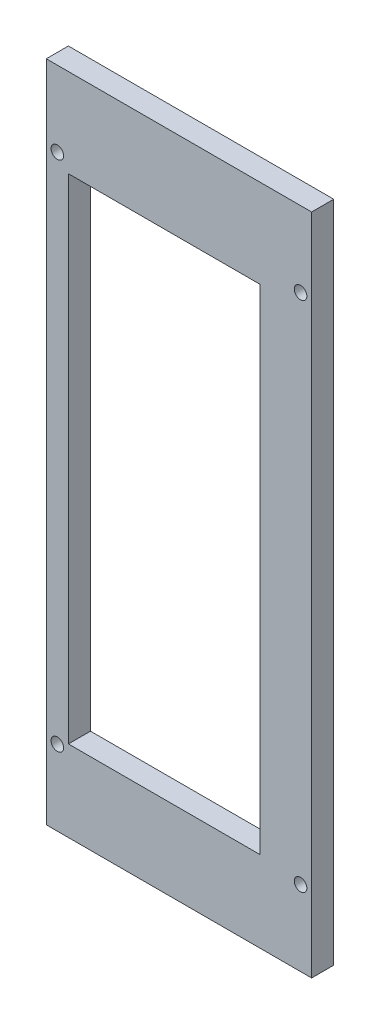
ISO-10303-21;
HEADER;
FILE_DESCRIPTION(('STEP AP214'),'2;1');
FILE_NAME('part.step','',(''),(''),'','','');
FILE_SCHEMA(('AUTOMOTIVE_DESIGN { 1 0 10303 214 1 1 1 1 }'));
ENDSEC;
DATA;
#1=APPLICATION_CONTEXT('core data for automotive mechanical design processes');
#2=APPLICATION_PROTOCOL_DEFINITION('international standard','automotive_design',2000,#1);
#3=PRODUCT_CONTEXT('',#1,'mechanical');
#4=PRODUCT('Part','Part','',(#3));
#5=PRODUCT_RELATED_PRODUCT_CATEGORY('part','',(#4));
#6=PRODUCT_DEFINITION_FORMATION('','',#4);
#7=PRODUCT_DEFINITION_CONTEXT('part definition',#1,'design');
#8=PRODUCT_DEFINITION('design','',#6,#7);
#9=PRODUCT_DEFINITION_SHAPE('','',#8);
#10=(LENGTH_UNIT() NAMED_UNIT(*) SI_UNIT(.MILLI.,.METRE.));
#11=(NAMED_UNIT(*) PLANE_ANGLE_UNIT() SI_UNIT($,.RADIAN.));
#12=(NAMED_UNIT(*) SI_UNIT($,.STERADIAN.) SOLID_ANGLE_UNIT());
#13=UNCERTAINTY_MEASURE_WITH_UNIT(LENGTH_MEASURE(1.E-05),#10,'distance_accuracy_value','');
#14=(GEOMETRIC_REPRESENTATION_CONTEXT(3) GLOBAL_UNCERTAINTY_ASSIGNED_CONTEXT((#13)) GLOBAL_UNIT_ASSIGNED_CONTEXT((#10,
#11,#12)) REPRESENTATION_CONTEXT('',''));
#15=CARTESIAN_POINT('',(0.,0.,0.));
#16=DIRECTION('',(0.,0.,1.));
#17=DIRECTION('',(1.,0.,0.));
#18=AXIS2_PLACEMENT_3D('',#15,#16,#17);
#19=CARTESIAN_POINT('',(0.,-18.0030709172956,3.));
#20=DIRECTION('',(0.,-1.,0.));
#21=DIRECTION('',(0.,0.,-1.));
#22=AXIS2_PLACEMENT_3D('',#19,#20,#21);
#23=PLANE('',#22);
#24=DIRECTION('',(0.,0.,1.));
#25=VECTOR('',#24,1.);
#26=CARTESIAN_POINT('',(29.,-18.0030709172956,-67.1192967781993));
#27=LINE('',#26,#25);
#28=CARTESIAN_POINT('',(29.,-18.0030709172956,0.));
#29=VERTEX_POINT('',#28);
#30=CARTESIAN_POINT('',(29.,-18.0030709172956,3.));
#31=VERTEX_POINT('',#30);
#32=EDGE_CURVE('E61',#29,#31,#27,.T.);
#33=ORIENTED_EDGE('',*,*,#32,.T.);
#34=DIRECTION('',(-1.,0.,0.));
#35=VECTOR('',#34,1.);
#36=CARTESIAN_POINT('',(0.,-18.0030709172956,3.));
#37=LINE('',#36,#35);
#38=CARTESIAN_POINT('',(3.,-18.0030709172956,3.));
#39=VERTEX_POINT('',#38);
#40=EDGE_CURVE('E69',#31,#39,#37,.T.);
#41=ORIENTED_EDGE('',*,*,#40,.T.);
#42=DIRECTION('',(0.,0.,-1.));
#43=VECTOR('',#42,1.);
#44=CARTESIAN_POINT('',(3.,-18.0030709172956,3.));
#45=LINE('',#44,#43);
#46=CARTESIAN_POINT('',(3.,-18.0030709172956,0.));
#47=VERTEX_POINT('',#46);
#48=EDGE_CURVE('E53',#39,#47,#45,.T.);
#49=ORIENTED_EDGE('',*,*,#48,.T.);
#50=DIRECTION('',(-1.,0.,0.));
#51=VECTOR('',#50,1.);
#52=CARTESIAN_POINT('',(0.,-18.0030709172956,0.));
#53=LINE('',#52,#51);
#54=EDGE_CURVE('E96',#29,#47,#53,.T.);
#55=ORIENTED_EDGE('',*,*,#54,.F.);
#56=EDGE_LOOP('',(#33,#41,#49,#55));
#57=FACE_BOUND('',#56,.T.);
#58=ADVANCED_FACE('F43',(#57),#23,.T.);
#59=CARTESIAN_POINT('',(0.,-85.0030709172956,3.));
#60=DIRECTION('',(0.,1.,0.));
#61=DIRECTION('',(0.,0.,1.));
#62=AXIS2_PLACEMENT_3D('',#59,#60,#61);
#63=PLANE('',#62);
#64=DIRECTION('',(0.,0.,1.));
#65=VECTOR('',#64,1.);
#66=CARTESIAN_POINT('',(29.,-85.0030709172956,-67.1192967781993));
#67=LINE('',#66,#65);
#68=CARTESIAN_POINT('',(29.,-85.0030709172956,0.));
#69=VERTEX_POINT('',#68);
#70=CARTESIAN_POINT('',(29.,-85.0030709172956,3.));
#71=VERTEX_POINT('',#70);
#72=EDGE_CURVE('E239',#69,#71,#67,.T.);
#73=ORIENTED_EDGE('',*,*,#72,.F.);
#74=DIRECTION('',(1.,0.,0.));
#75=VECTOR('',#74,1.);
#76=CARTESIAN_POINT('',(0.,-85.0030709172956,0.));
#77=LINE('',#76,#75);
#78=CARTESIAN_POINT('',(3.00000000000001,-85.0030709172956,0.));
#79=VERTEX_POINT('',#78);
#80=EDGE_CURVE('E169',#79,#69,#77,.T.);
#81=ORIENTED_EDGE('',*,*,#80,.F.);
#82=DIRECTION('',(0.,0.,-1.));
#83=VECTOR('',#82,1.);
#84=CARTESIAN_POINT('',(3.00000000000001,-85.0030709172956,3.));
#85=LINE('',#84,#83);
#86=CARTESIAN_POINT('',(3.00000000000001,-85.0030709172956,3.));
#87=VERTEX_POINT('',#86);
#88=EDGE_CURVE('E11',#87,#79,#85,.T.);
#89=ORIENTED_EDGE('',*,*,#88,.F.);
#90=DIRECTION('',(1.,0.,0.));
#91=VECTOR('',#90,1.);
#92=CARTESIAN_POINT('',(0.,-85.0030709172956,3.));
#93=LINE('',#92,#91);
#94=EDGE_CURVE('E142',#87,#71,#93,.T.);
#95=ORIENTED_EDGE('',*,*,#94,.T.);
#96=EDGE_LOOP('',(#73,#81,#89,#95));
#97=FACE_BOUND('',#96,.T.);
#98=ADVANCED_FACE('F199',(#97),#63,.T.);
#99=CARTESIAN_POINT('',(0.,-6.00307091729556,3.));
#100=DIRECTION('',(0.,1.,0.));
#101=DIRECTION('',(0.,0.,1.));
#102=AXIS2_PLACEMENT_3D('',#99,#100,#101);
#103=PLANE('',#102);
#104=DIRECTION('',(1.,0.,0.));
#105=VECTOR('',#104,1.);
#106=CARTESIAN_POINT('',(0.,-6.00307091729556,0.));
#107=LINE('',#106,#105);
#108=CARTESIAN_POINT('',(0.,-6.00307091729556,0.));
#109=VERTEX_POINT('',#108);
#110=CARTESIAN_POINT('',(36.,-6.00307091729556,0.));
#111=VERTEX_POINT('',#110);
#112=EDGE_CURVE('E153',#109,#111,#107,.T.);
#113=ORIENTED_EDGE('',*,*,#112,.F.);
#114=DIRECTION('',(0.,0.,-1.));
#115=VECTOR('',#114,1.);
#116=CARTESIAN_POINT('',(0.,-6.00307091729556,3.));
#117=LINE('',#116,#115);
#118=CARTESIAN_POINT('',(0.,-6.00307091729556,3.));
#119=VERTEX_POINT('',#118);
#120=EDGE_CURVE('E47',#119,#109,#117,.T.);
#121=ORIENTED_EDGE('',*,*,#120,.F.);
#122=DIRECTION('',(1.,0.,0.));
#123=VECTOR('',#122,1.);
#124=CARTESIAN_POINT('',(0.,-6.00307091729556,3.));
#125=LINE('',#124,#123);
#126=CARTESIAN_POINT('',(36.,-6.00307091729556,3.));
#127=VERTEX_POINT('',#126);
#128=EDGE_CURVE('E127',#119,#127,#125,.T.);
#129=ORIENTED_EDGE('',*,*,#128,.T.);
#130=DIRECTION('',(0.,0.,-1.));
#131=VECTOR('',#130,1.);
#132=CARTESIAN_POINT('',(36.,-6.00307091729556,3.));
#133=LINE('',#132,#131);
#134=EDGE_CURVE('E115',#127,#111,#133,.T.);
#135=ORIENTED_EDGE('',*,*,#134,.T.);
#136=EDGE_LOOP('',(#113,#121,#129,#135));
#137=FACE_BOUND('',#136,.T.);
#138=ADVANCED_FACE('F45',(#137),#103,.T.);
#139=CARTESIAN_POINT('',(0.,0.,3.));
#140=DIRECTION('',(1.,0.,0.));
#141=DIRECTION('',(0.,0.,-1.));
#142=AXIS2_PLACEMENT_3D('',#139,#140,#141);
#143=PLANE('',#142);
#144=DIRECTION('',(0.,-1.,0.));
#145=VECTOR('',#144,1.);
#146=CARTESIAN_POINT('',(0.,0.,0.));
#147=LINE('',#146,#145);
#148=CARTESIAN_POINT('',(0.,-96.0030709172956,0.));
#149=VERTEX_POINT('',#148);
#150=EDGE_CURVE('E156',#109,#149,#147,.T.);
#151=ORIENTED_EDGE('',*,*,#150,.T.);
#152=DIRECTION('',(0.,0.,-1.));
#153=VECTOR('',#152,1.);
#154=CARTESIAN_POINT('',(0.,-96.0030709172956,3.));
#155=LINE('',#154,#153);
#156=CARTESIAN_POINT('',(0.,-96.0030709172956,3.));
#157=VERTEX_POINT('',#156);
#158=EDGE_CURVE('E178',#157,#149,#155,.T.);
#159=ORIENTED_EDGE('',*,*,#158,.F.);
#160=DIRECTION('',(0.,-1.,0.));
#161=VECTOR('',#160,1.);
#162=CARTESIAN_POINT('',(0.,0.,3.));
#163=LINE('',#162,#161);
#164=EDGE_CURVE('E130',#119,#157,#163,.T.);
#165=ORIENTED_EDGE('',*,*,#164,.F.);
#166=ORIENTED_EDGE('',*,*,#120,.T.);
#167=EDGE_LOOP('',(#151,#159,#165,#166));
#168=FACE_BOUND('',#167,.T.);
#169=ADVANCED_FACE('F186',(#168),#143,.F.);
#170=CARTESIAN_POINT('',(0.,-96.0030709172956,3.));
#171=DIRECTION('',(0.,-1.,0.));
#172=DIRECTION('',(0.,0.,-1.));
#173=AXIS2_PLACEMENT_3D('',#170,#171,#172);
#174=PLANE('',#173);
#175=DIRECTION('',(-1.,0.,0.));
#176=VECTOR('',#175,1.);
#177=CARTESIAN_POINT('',(0.,-96.0030709172956,0.));
#178=LINE('',#177,#176);
#179=CARTESIAN_POINT('',(36.,-96.0030709172956,0.));
#180=VERTEX_POINT('',#179);
#181=EDGE_CURVE('E161',#180,#149,#178,.T.);
#182=ORIENTED_EDGE('',*,*,#181,.F.);
#183=DIRECTION('',(0.,0.,-1.));
#184=VECTOR('',#183,1.);
#185=CARTESIAN_POINT('',(36.,-96.0030709172956,3.));
#186=LINE('',#185,#184);
#187=CARTESIAN_POINT('',(36.,-96.0030709172956,3.));
#188=VERTEX_POINT('',#187);
#189=EDGE_CURVE('E123',#188,#180,#186,.T.);
#190=ORIENTED_EDGE('',*,*,#189,.F.);
#191=DIRECTION('',(-1.,0.,0.));
#192=VECTOR('',#191,1.);
#193=CARTESIAN_POINT('',(0.,-96.0030709172956,3.));
#194=LINE('',#193,#192);
#195=EDGE_CURVE('E137',#188,#157,#194,.T.);
#196=ORIENTED_EDGE('',*,*,#195,.T.);
#197=ORIENTED_EDGE('',*,*,#158,.T.);
#198=EDGE_LOOP('',(#182,#190,#196,#197));
#199=FACE_BOUND('',#198,.T.);
#200=ADVANCED_FACE('F189',(#199),#174,.T.);
#201=CARTESIAN_POINT('',(36.,0.,3.));
#202=DIRECTION('',(1.,0.,0.));
#203=DIRECTION('',(0.,0.,-1.));
#204=AXIS2_PLACEMENT_3D('',#201,#202,#203);
#205=PLANE('',#204);
#206=DIRECTION('',(0.,-1.,0.));
#207=VECTOR('',#206,1.);
#208=CARTESIAN_POINT('',(36.,0.,0.));
#209=LINE('',#208,#207);
#210=EDGE_CURVE('E120',#111,#180,#209,.T.);
#211=ORIENTED_EDGE('',*,*,#210,.F.);
#212=ORIENTED_EDGE('',*,*,#134,.F.);
#213=DIRECTION('',(0.,-1.,0.));
#214=VECTOR('',#213,1.);
#215=CARTESIAN_POINT('',(36.,0.,3.));
#216=LINE('',#215,#214);
#217=EDGE_CURVE('E118',#127,#188,#216,.T.);
#218=ORIENTED_EDGE('',*,*,#217,.T.);
#219=ORIENTED_EDGE('',*,*,#189,.T.);
#220=EDGE_LOOP('',(#211,#212,#218,#219));
#221=FACE_BOUND('',#220,.T.);
#222=ADVANCED_FACE('F116',(#221),#205,.T.);
#223=CARTESIAN_POINT('',(3.,0.,3.));
#224=DIRECTION('',(1.,0.,0.));
#225=DIRECTION('',(0.,1.,0.));
#226=AXIS2_PLACEMENT_3D('',#223,#224,#225);
#227=PLANE('',#226);
#228=DIRECTION('',(0.,-1.,0.));
#229=VECTOR('',#228,1.);
#230=CARTESIAN_POINT('',(3.,0.,0.));
#231=LINE('',#230,#229);
#232=EDGE_CURVE('E131',#47,#79,#231,.T.);
#233=ORIENTED_EDGE('',*,*,#232,.F.);
#234=ORIENTED_EDGE('',*,*,#48,.F.);
#235=DIRECTION('',(0.,-1.,0.));
#236=VECTOR('',#235,1.);
#237=CARTESIAN_POINT('',(3.,0.,3.));
#238=LINE('',#237,#236);
#239=EDGE_CURVE('E124',#39,#87,#238,.T.);
#240=ORIENTED_EDGE('',*,*,#239,.T.);
#241=ORIENTED_EDGE('',*,*,#88,.T.);
#242=EDGE_LOOP('',(#233,#234,#240,#241));
#243=FACE_BOUND('',#242,.T.);
#244=ADVANCED_FACE('F196',(#243),#227,.T.);
#245=CARTESIAN_POINT('',(0.,0.,3.));
#246=DIRECTION('',(0.,0.,1.));
#247=DIRECTION('',(1.,0.,0.));
#248=AXIS2_PLACEMENT_3D('',#245,#246,#247);
#249=PLANE('',#248);
#250=CARTESIAN_POINT('',(34.5,-85.7815222968214,3.));
#251=DIRECTION('',(0.,0.,1.));
#252=DIRECTION('',(1.,0.,0.));
#253=AXIS2_PLACEMENT_3D('',#250,#251,#252);
#254=CIRCLE('',#253,0.850000000000007);
#255=CARTESIAN_POINT('',(33.65,-85.7815222968214,3.));
#256=VERTEX_POINT('',#255);
#257=EDGE_CURVE('E272',#256,#256,#254,.F.);
#258=ORIENTED_EDGE('',*,*,#257,.T.);
#259=EDGE_LOOP('',(#258));
#260=FACE_BOUND('',#259,.T.);
#261=CARTESIAN_POINT('',(1.50000000000002,-85.7815222968214,3.));
#262=DIRECTION('',(0.,0.,1.));
#263=DIRECTION('',(1.,0.,0.));
#264=AXIS2_PLACEMENT_3D('',#261,#262,#263);
#265=CIRCLE('',#264,0.850000000000002);
#266=CARTESIAN_POINT('',(0.65000000000002,-85.7815222968214,3.));
#267=VERTEX_POINT('',#266);
#268=EDGE_CURVE('E263',#267,#267,#265,.F.);
#269=ORIENTED_EDGE('',*,*,#268,.T.);
#270=EDGE_LOOP('',(#269));
#271=FACE_BOUND('',#270,.T.);
#272=CARTESIAN_POINT('',(1.50000000000001,-16.2246195377698,3.));
#273=DIRECTION('',(0.,0.,1.));
#274=DIRECTION('',(1.,0.,0.));
#275=AXIS2_PLACEMENT_3D('',#272,#273,#274);
#276=CIRCLE('',#275,0.85);
#277=CARTESIAN_POINT('',(0.650000000000008,-16.2246195377698,3.));
#278=VERTEX_POINT('',#277);
#279=EDGE_CURVE('E262',#278,#278,#276,.F.);
#280=ORIENTED_EDGE('',*,*,#279,.T.);
#281=EDGE_LOOP('',(#280));
#282=FACE_BOUND('',#281,.T.);
#283=CARTESIAN_POINT('',(34.5,-16.2246195377698,3.));
#284=DIRECTION('',(0.,0.,1.));
#285=DIRECTION('',(1.,0.,0.));
#286=AXIS2_PLACEMENT_3D('',#283,#284,#285);
#287=CIRCLE('',#286,0.85);
#288=CARTESIAN_POINT('',(33.65,-16.2246195377698,3.));
#289=VERTEX_POINT('',#288);
#290=EDGE_CURVE('E157',#289,#289,#287,.F.);
#291=ORIENTED_EDGE('',*,*,#290,.T.);
#292=EDGE_LOOP('',(#291));
#293=FACE_BOUND('',#292,.T.);
#294=ORIENTED_EDGE('',*,*,#128,.F.);
#295=ORIENTED_EDGE('',*,*,#164,.T.);
#296=ORIENTED_EDGE('',*,*,#195,.F.);
#297=ORIENTED_EDGE('',*,*,#217,.F.);
#298=EDGE_LOOP('',(#294,#295,#296,#297));
#299=FACE_BOUND('',#298,.T.);
#300=ORIENTED_EDGE('',*,*,#40,.F.);
#301=DIRECTION('',(0.,-1.,0.));
#302=VECTOR('',#301,1.);
#303=CARTESIAN_POINT('',(29.,-18.0030709172956,3.));
#304=LINE('',#303,#302);
#305=EDGE_CURVE('E251',#31,#71,#304,.T.);
#306=ORIENTED_EDGE('',*,*,#305,.T.);
#307=ORIENTED_EDGE('',*,*,#94,.F.);
#308=ORIENTED_EDGE('',*,*,#239,.F.);
#309=EDGE_LOOP('',(#300,#306,#307,#308));
#310=FACE_BOUND('',#309,.T.);
#311=ADVANCED_FACE('F134',(#260,#271,#282,#293,#299,#310),#249,.T.);
#312=CARTESIAN_POINT('',(0.,0.,0.));
#313=DIRECTION('',(0.,0.,1.));
#314=DIRECTION('',(1.,0.,0.));
#315=AXIS2_PLACEMENT_3D('',#312,#313,#314);
#316=PLANE('',#315);
#317=ORIENTED_EDGE('',*,*,#80,.T.);
#318=DIRECTION('',(0.,1.,0.));
#319=VECTOR('',#318,1.);
#320=CARTESIAN_POINT('',(29.,-18.0030709172956,0.));
#321=LINE('',#320,#319);
#322=EDGE_CURVE('E236',#69,#29,#321,.T.);
#323=ORIENTED_EDGE('',*,*,#322,.T.);
#324=ORIENTED_EDGE('',*,*,#54,.T.);
#325=ORIENTED_EDGE('',*,*,#232,.T.);
#326=EDGE_LOOP('',(#317,#323,#324,#325));
#327=FACE_BOUND('',#326,.T.);
#328=CARTESIAN_POINT('',(34.5,-85.7815222968214,0.));
#329=DIRECTION('',(0.,0.,-1.));
#330=DIRECTION('',(1.,0.,0.));
#331=AXIS2_PLACEMENT_3D('',#328,#329,#330);
#332=CIRCLE('',#331,0.850000000000007);
#333=CARTESIAN_POINT('',(33.65,-85.7815222968214,0.));
#334=VERTEX_POINT('',#333);
#335=EDGE_CURVE('E242',#334,#334,#332,.T.);
#336=ORIENTED_EDGE('',*,*,#335,.F.);
#337=EDGE_LOOP('',(#336));
#338=FACE_BOUND('',#337,.T.);
#339=CARTESIAN_POINT('',(1.50000000000002,-85.7815222968214,0.));
#340=DIRECTION('',(0.,0.,-1.));
#341=DIRECTION('',(-1.,0.,0.));
#342=AXIS2_PLACEMENT_3D('',#339,#340,#341);
#343=CIRCLE('',#342,0.850000000000002);
#344=CARTESIAN_POINT('',(0.65000000000002,-85.7815222968214,0.));
#345=VERTEX_POINT('',#344);
#346=EDGE_CURVE('E268',#345,#345,#343,.T.);
#347=ORIENTED_EDGE('',*,*,#346,.F.);
#348=EDGE_LOOP('',(#347));
#349=FACE_BOUND('',#348,.T.);
#350=CARTESIAN_POINT('',(1.50000000000001,-16.2246195377698,0.));
#351=DIRECTION('',(0.,0.,-1.));
#352=DIRECTION('',(1.,0.,0.));
#353=AXIS2_PLACEMENT_3D('',#350,#351,#352);
#354=CIRCLE('',#353,0.85);
#355=CARTESIAN_POINT('',(0.650000000000008,-16.2246195377698,0.));
#356=VERTEX_POINT('',#355);
#357=EDGE_CURVE('E258',#356,#356,#354,.T.);
#358=ORIENTED_EDGE('',*,*,#357,.F.);
#359=EDGE_LOOP('',(#358));
#360=FACE_BOUND('',#359,.T.);
#361=CARTESIAN_POINT('',(34.5,-16.2246195377698,0.));
#362=DIRECTION('',(0.,0.,-1.));
#363=DIRECTION('',(-1.,0.,0.));
#364=AXIS2_PLACEMENT_3D('',#361,#362,#363);
#365=CIRCLE('',#364,0.85);
#366=CARTESIAN_POINT('',(33.65,-16.2246195377698,0.));
#367=VERTEX_POINT('',#366);
#368=EDGE_CURVE('E267',#367,#367,#365,.T.);
#369=ORIENTED_EDGE('',*,*,#368,.F.);
#370=EDGE_LOOP('',(#369));
#371=FACE_BOUND('',#370,.T.);
#372=ORIENTED_EDGE('',*,*,#112,.T.);
#373=ORIENTED_EDGE('',*,*,#210,.T.);
#374=ORIENTED_EDGE('',*,*,#181,.T.);
#375=ORIENTED_EDGE('',*,*,#150,.F.);
#376=EDGE_LOOP('',(#372,#373,#374,#375));
#377=FACE_BOUND('',#376,.T.);
#378=ADVANCED_FACE('F188',(#327,#338,#349,#360,#371,#377),#316,.F.);
#379=CARTESIAN_POINT('',(34.5,-16.2246195377698,5.40416305603428));
#380=DIRECTION('',(0.,0.,-1.));
#381=DIRECTION('',(-1.,0.,0.));
#382=AXIS2_PLACEMENT_3D('',#379,#380,#381);
#383=CYLINDRICAL_SURFACE('',#382,0.85);
#384=CARTESIAN_POINT('',(33.65,-16.2246195377698,0.));
#385=CARTESIAN_POINT('',(33.65,-16.2246195377698,0.0312500000000009));
#386=CARTESIAN_POINT('',(33.65,-16.2246195377698,0.0625000000000009));
#387=CARTESIAN_POINT('',(33.65,-16.2246195377698,0.125000000000001));
#388=CARTESIAN_POINT('',(33.65,-16.2246195377698,0.156250000000001));
#389=CARTESIAN_POINT('',(33.65,-16.2246195377698,0.218750000000001));
#390=CARTESIAN_POINT('',(33.65,-16.2246195377698,0.250000000000001));
#391=CARTESIAN_POINT('',(33.65,-16.2246195377698,0.312500000000001));
#392=CARTESIAN_POINT('',(33.65,-16.2246195377698,0.343750000000001));
#393=CARTESIAN_POINT('',(33.65,-16.2246195377698,0.406250000000001));
#394=CARTESIAN_POINT('',(33.65,-16.2246195377698,0.437500000000001));
#395=CARTESIAN_POINT('',(33.65,-16.2246195377698,0.5));
#396=CARTESIAN_POINT('',(33.65,-16.2246195377698,0.53125));
#397=CARTESIAN_POINT('',(33.65,-16.2246195377698,0.593750000000001));
#398=CARTESIAN_POINT('',(33.65,-16.2246195377698,0.625000000000001));
#399=CARTESIAN_POINT('',(33.65,-16.2246195377698,0.687500000000001));
#400=CARTESIAN_POINT('',(33.65,-16.2246195377698,0.718750000000001));
#401=CARTESIAN_POINT('',(33.65,-16.2246195377698,0.781250000000001));
#402=CARTESIAN_POINT('',(33.65,-16.2246195377698,0.812500000000001));
#403=CARTESIAN_POINT('',(33.65,-16.2246195377698,0.875000000000001));
#404=CARTESIAN_POINT('',(33.65,-16.2246195377698,0.906250000000001));
#405=CARTESIAN_POINT('',(33.65,-16.2246195377698,0.968750000000001));
#406=CARTESIAN_POINT('',(33.65,-16.2246195377698,1.));
#407=CARTESIAN_POINT('',(33.65,-16.2246195377698,1.0625));
#408=CARTESIAN_POINT('',(33.65,-16.2246195377698,1.09375));
#409=CARTESIAN_POINT('',(33.65,-16.2246195377698,1.15625));
#410=CARTESIAN_POINT('',(33.65,-16.2246195377698,1.1875));
#411=CARTESIAN_POINT('',(33.65,-16.2246195377698,1.25));
#412=CARTESIAN_POINT('',(33.65,-16.2246195377698,1.28125));
#413=CARTESIAN_POINT('',(33.65,-16.2246195377698,1.34375));
#414=CARTESIAN_POINT('',(33.65,-16.2246195377698,1.375));
#415=CARTESIAN_POINT('',(33.65,-16.2246195377698,1.4375));
#416=CARTESIAN_POINT('',(33.65,-16.2246195377698,1.46875));
#417=CARTESIAN_POINT('',(33.65,-16.2246195377698,1.53125));
#418=CARTESIAN_POINT('',(33.65,-16.2246195377698,1.5625));
#419=CARTESIAN_POINT('',(33.65,-16.2246195377698,1.625));
#420=CARTESIAN_POINT('',(33.65,-16.2246195377698,1.65625));
#421=CARTESIAN_POINT('',(33.65,-16.2246195377698,1.71875));
#422=CARTESIAN_POINT('',(33.65,-16.2246195377698,1.75));
#423=CARTESIAN_POINT('',(33.65,-16.2246195377698,1.8125));
#424=CARTESIAN_POINT('',(33.65,-16.2246195377698,1.84375));
#425=CARTESIAN_POINT('',(33.65,-16.2246195377698,1.90625));
#426=CARTESIAN_POINT('',(33.65,-16.2246195377698,1.9375));
#427=CARTESIAN_POINT('',(33.65,-16.2246195377698,2.));
#428=CARTESIAN_POINT('',(33.65,-16.2246195377698,2.03125));
#429=CARTESIAN_POINT('',(33.65,-16.2246195377698,2.09375));
#430=CARTESIAN_POINT('',(33.65,-16.2246195377698,2.125));
#431=CARTESIAN_POINT('',(33.65,-16.2246195377698,2.1875));
#432=CARTESIAN_POINT('',(33.65,-16.2246195377698,2.21875));
#433=CARTESIAN_POINT('',(33.65,-16.2246195377698,2.28125));
#434=CARTESIAN_POINT('',(33.65,-16.2246195377698,2.3125));
#435=CARTESIAN_POINT('',(33.65,-16.2246195377698,2.375));
#436=CARTESIAN_POINT('',(33.65,-16.2246195377698,2.40625));
#437=CARTESIAN_POINT('',(33.65,-16.2246195377698,2.46875));
#438=CARTESIAN_POINT('',(33.65,-16.2246195377698,2.5));
#439=CARTESIAN_POINT('',(33.65,-16.2246195377698,2.5625));
#440=CARTESIAN_POINT('',(33.65,-16.2246195377698,2.59375));
#441=CARTESIAN_POINT('',(33.65,-16.2246195377698,2.65625));
#442=CARTESIAN_POINT('',(33.65,-16.2246195377698,2.6875));
#443=CARTESIAN_POINT('',(33.65,-16.2246195377698,2.75));
#444=CARTESIAN_POINT('',(33.65,-16.2246195377698,2.78125));
#445=CARTESIAN_POINT('',(33.65,-16.2246195377698,2.84375));
#446=CARTESIAN_POINT('',(33.65,-16.2246195377698,2.875));
#447=CARTESIAN_POINT('',(33.65,-16.2246195377698,2.9375));
#448=CARTESIAN_POINT('',(33.65,-16.2246195377698,2.96875));
#449=CARTESIAN_POINT('',(33.65,-16.2246195377698,3.));
#450=B_SPLINE_CURVE_WITH_KNOTS('',3,(#384,#385,#386,#387,#388,#389,#390,#391,#392,#393,#394,
#395,#396,#397,#398,#399,#400,#401,#402,#403,#404,#405,#406,#407,#408,#409,#410,#411,#412,#413,
#414,#415,#416,#417,#418,#419,#420,#421,#422,#423,#424,#425,#426,#427,#428,#429,#430,#431,#432,
#433,#434,#435,#436,#437,#438,#439,#440,#441,#442,#443,#444,#445,#446,#447,#448,#449),
.UNSPECIFIED.,.F.,.F.,(4,2,2,2,2,2,2,2,2,2,2,2,2,2,2,2,2,2,2,2,2,2,2,2,2,2,2,2,2,2,2,2,4),(0.,
0.0937500000000001,0.1875,0.28125,0.375,0.46875,0.5625,0.65625,0.75,0.84375,0.9375,1.03125,
1.125,1.21875,1.3125,1.40625,1.5,1.59375,1.6875,1.78125,1.875,1.96875,2.0625,2.15625,2.25,
2.34375,2.4375,2.53125,2.625,2.71875,2.8125,2.90625,3.),.UNSPECIFIED.);
#451=EDGE_CURVE('BSEAM212',#367,#289,#450,.T.);
#452=ORIENTED_EDGE('',*,*,#368,.T.);
#453=ORIENTED_EDGE('',*,*,#290,.F.);
#454=ORIENTED_EDGE('',*,*,#451,.T.);
#455=ORIENTED_EDGE('',*,*,#451,.F.);
#456=EDGE_LOOP('',(#452,#454,#453,#455));
#457=FACE_BOUND('',#456,.T.);
#458=ADVANCED_FACE('F212',(#457),#383,.F.);
#459=CARTESIAN_POINT('',(1.50000000000001,-16.2246195377698,5.40416305603428));
#460=DIRECTION('',(0.,0.,-1.));
#461=DIRECTION('',(-1.,0.,0.));
#462=AXIS2_PLACEMENT_3D('',#459,#460,#461);
#463=CYLINDRICAL_SURFACE('',#462,0.85);
#464=CARTESIAN_POINT('',(0.650000000000008,-16.2246195377698,0.));
#465=CARTESIAN_POINT('',(0.650000000000008,-16.2246195377698,0.0312500000000009));
#466=CARTESIAN_POINT('',(0.650000000000008,-16.2246195377698,0.0625000000000009));
#467=CARTESIAN_POINT('',(0.650000000000008,-16.2246195377698,0.125000000000001));
#468=CARTESIAN_POINT('',(0.650000000000008,-16.2246195377698,0.156250000000001));
#469=CARTESIAN_POINT('',(0.650000000000008,-16.2246195377698,0.218750000000001));
#470=CARTESIAN_POINT('',(0.650000000000008,-16.2246195377698,0.250000000000001));
#471=CARTESIAN_POINT('',(0.650000000000008,-16.2246195377698,0.312500000000001));
#472=CARTESIAN_POINT('',(0.650000000000008,-16.2246195377698,0.343750000000001));
#473=CARTESIAN_POINT('',(0.650000000000008,-16.2246195377698,0.406250000000001));
#474=CARTESIAN_POINT('',(0.650000000000008,-16.2246195377698,0.437500000000001));
#475=CARTESIAN_POINT('',(0.650000000000008,-16.2246195377698,0.5));
#476=CARTESIAN_POINT('',(0.650000000000008,-16.2246195377698,0.53125));
#477=CARTESIAN_POINT('',(0.650000000000008,-16.2246195377698,0.593750000000001));
#478=CARTESIAN_POINT('',(0.650000000000008,-16.2246195377698,0.625000000000001));
#479=CARTESIAN_POINT('',(0.650000000000008,-16.2246195377698,0.687500000000001));
#480=CARTESIAN_POINT('',(0.650000000000008,-16.2246195377698,0.718750000000001));
#481=CARTESIAN_POINT('',(0.650000000000008,-16.2246195377698,0.781250000000001));
#482=CARTESIAN_POINT('',(0.650000000000008,-16.2246195377698,0.812500000000001));
#483=CARTESIAN_POINT('',(0.650000000000008,-16.2246195377698,0.875000000000001));
#484=CARTESIAN_POINT('',(0.650000000000008,-16.2246195377698,0.906250000000001));
#485=CARTESIAN_POINT('',(0.650000000000008,-16.2246195377698,0.968750000000001));
#486=CARTESIAN_POINT('',(0.650000000000008,-16.2246195377698,1.));
#487=CARTESIAN_POINT('',(0.650000000000008,-16.2246195377698,1.0625));
#488=CARTESIAN_POINT('',(0.650000000000008,-16.2246195377698,1.09375));
#489=CARTESIAN_POINT('',(0.650000000000008,-16.2246195377698,1.15625));
#490=CARTESIAN_POINT('',(0.650000000000008,-16.2246195377698,1.1875));
#491=CARTESIAN_POINT('',(0.650000000000008,-16.2246195377698,1.25));
#492=CARTESIAN_POINT('',(0.650000000000008,-16.2246195377698,1.28125));
#493=CARTESIAN_POINT('',(0.650000000000008,-16.2246195377698,1.34375));
#494=CARTESIAN_POINT('',(0.650000000000008,-16.2246195377698,1.375));
#495=CARTESIAN_POINT('',(0.650000000000008,-16.2246195377698,1.4375));
#496=CARTESIAN_POINT('',(0.650000000000008,-16.2246195377698,1.46875));
#497=CARTESIAN_POINT('',(0.650000000000008,-16.2246195377698,1.53125));
#498=CARTESIAN_POINT('',(0.650000000000008,-16.2246195377698,1.5625));
#499=CARTESIAN_POINT('',(0.650000000000008,-16.2246195377698,1.625));
#500=CARTESIAN_POINT('',(0.650000000000008,-16.2246195377698,1.65625));
#501=CARTESIAN_POINT('',(0.650000000000008,-16.2246195377698,1.71875));
#502=CARTESIAN_POINT('',(0.650000000000008,-16.2246195377698,1.75));
#503=CARTESIAN_POINT('',(0.650000000000008,-16.2246195377698,1.8125));
#504=CARTESIAN_POINT('',(0.650000000000008,-16.2246195377698,1.84375));
#505=CARTESIAN_POINT('',(0.650000000000008,-16.2246195377698,1.90625));
#506=CARTESIAN_POINT('',(0.650000000000008,-16.2246195377698,1.9375));
#507=CARTESIAN_POINT('',(0.650000000000008,-16.2246195377698,2.));
#508=CARTESIAN_POINT('',(0.650000000000008,-16.2246195377698,2.03125));
#509=CARTESIAN_POINT('',(0.650000000000008,-16.2246195377698,2.09375));
#510=CARTESIAN_POINT('',(0.650000000000008,-16.2246195377698,2.125));
#511=CARTESIAN_POINT('',(0.650000000000008,-16.2246195377698,2.1875));
#512=CARTESIAN_POINT('',(0.650000000000008,-16.2246195377698,2.21875));
#513=CARTESIAN_POINT('',(0.650000000000008,-16.2246195377698,2.28125));
#514=CARTESIAN_POINT('',(0.650000000000008,-16.2246195377698,2.3125));
#515=CARTESIAN_POINT('',(0.650000000000008,-16.2246195377698,2.375));
#516=CARTESIAN_POINT('',(0.650000000000008,-16.2246195377698,2.40625));
#517=CARTESIAN_POINT('',(0.650000000000008,-16.2246195377698,2.46875));
#518=CARTESIAN_POINT('',(0.650000000000008,-16.2246195377698,2.5));
#519=CARTESIAN_POINT('',(0.650000000000008,-16.2246195377698,2.5625));
#520=CARTESIAN_POINT('',(0.650000000000008,-16.2246195377698,2.59375));
#521=CARTESIAN_POINT('',(0.650000000000008,-16.2246195377698,2.65625));
#522=CARTESIAN_POINT('',(0.650000000000008,-16.2246195377698,2.6875));
#523=CARTESIAN_POINT('',(0.650000000000008,-16.2246195377698,2.75));
#524=CARTESIAN_POINT('',(0.650000000000008,-16.2246195377698,2.78125));
#525=CARTESIAN_POINT('',(0.650000000000008,-16.2246195377698,2.84375));
#526=CARTESIAN_POINT('',(0.650000000000008,-16.2246195377698,2.875));
#527=CARTESIAN_POINT('',(0.650000000000008,-16.2246195377698,2.9375));
#528=CARTESIAN_POINT('',(0.650000000000008,-16.2246195377698,2.96875));
#529=CARTESIAN_POINT('',(0.650000000000008,-16.2246195377698,3.));
#530=B_SPLINE_CURVE_WITH_KNOTS('',3,(#464,#465,#466,#467,#468,#469,#470,#471,#472,#473,#474,
#475,#476,#477,#478,#479,#480,#481,#482,#483,#484,#485,#486,#487,#488,#489,#490,#491,#492,#493,
#494,#495,#496,#497,#498,#499,#500,#501,#502,#503,#504,#505,#506,#507,#508,#509,#510,#511,#512,
#513,#514,#515,#516,#517,#518,#519,#520,#521,#522,#523,#524,#525,#526,#527,#528,#529),
.UNSPECIFIED.,.F.,.F.,(4,2,2,2,2,2,2,2,2,2,2,2,2,2,2,2,2,2,2,2,2,2,2,2,2,2,2,2,2,2,2,2,4),(0.,
0.0937500000000001,0.1875,0.28125,0.375,0.46875,0.5625,0.65625,0.75,0.84375,0.9375,1.03125,
1.125,1.21875,1.3125,1.40625,1.5,1.59375,1.6875,1.78125,1.875,1.96875,2.0625,2.15625,2.25,
2.34375,2.4375,2.53125,2.625,2.71875,2.8125,2.90625,3.),.UNSPECIFIED.);
#531=EDGE_CURVE('BSEAM218',#356,#278,#530,.T.);
#532=ORIENTED_EDGE('',*,*,#357,.T.);
#533=ORIENTED_EDGE('',*,*,#279,.F.);
#534=ORIENTED_EDGE('',*,*,#531,.T.);
#535=ORIENTED_EDGE('',*,*,#531,.F.);
#536=EDGE_LOOP('',(#532,#534,#533,#535));
#537=FACE_BOUND('',#536,.T.);
#538=ADVANCED_FACE('F218',(#537),#463,.F.);
#539=CARTESIAN_POINT('',(1.50000000000002,-85.7815222968214,5.40416305603428));
#540=DIRECTION('',(0.,0.,-1.));
#541=DIRECTION('',(-1.,0.,0.));
#542=AXIS2_PLACEMENT_3D('',#539,#540,#541);
#543=CYLINDRICAL_SURFACE('',#542,0.850000000000002);
#544=CARTESIAN_POINT('',(0.65000000000002,-85.7815222968214,0.));
#545=CARTESIAN_POINT('',(0.65000000000002,-85.7815222968214,0.0312500000000009));
#546=CARTESIAN_POINT('',(0.65000000000002,-85.7815222968214,0.0625000000000009));
#547=CARTESIAN_POINT('',(0.65000000000002,-85.7815222968214,0.125000000000001));
#548=CARTESIAN_POINT('',(0.65000000000002,-85.7815222968214,0.156250000000001));
#549=CARTESIAN_POINT('',(0.65000000000002,-85.7815222968214,0.218750000000001));
#550=CARTESIAN_POINT('',(0.65000000000002,-85.7815222968214,0.250000000000001));
#551=CARTESIAN_POINT('',(0.65000000000002,-85.7815222968214,0.312500000000001));
#552=CARTESIAN_POINT('',(0.65000000000002,-85.7815222968214,0.343750000000001));
#553=CARTESIAN_POINT('',(0.65000000000002,-85.7815222968214,0.406250000000001));
#554=CARTESIAN_POINT('',(0.65000000000002,-85.7815222968214,0.437500000000001));
#555=CARTESIAN_POINT('',(0.65000000000002,-85.7815222968214,0.5));
#556=CARTESIAN_POINT('',(0.65000000000002,-85.7815222968214,0.53125));
#557=CARTESIAN_POINT('',(0.65000000000002,-85.7815222968214,0.593750000000001));
#558=CARTESIAN_POINT('',(0.65000000000002,-85.7815222968214,0.625000000000001));
#559=CARTESIAN_POINT('',(0.65000000000002,-85.7815222968214,0.687500000000001));
#560=CARTESIAN_POINT('',(0.65000000000002,-85.7815222968214,0.718750000000001));
#561=CARTESIAN_POINT('',(0.65000000000002,-85.7815222968214,0.781250000000001));
#562=CARTESIAN_POINT('',(0.65000000000002,-85.7815222968214,0.812500000000001));
#563=CARTESIAN_POINT('',(0.65000000000002,-85.7815222968214,0.875000000000001));
#564=CARTESIAN_POINT('',(0.65000000000002,-85.7815222968214,0.906250000000001));
#565=CARTESIAN_POINT('',(0.65000000000002,-85.7815222968214,0.968750000000001));
#566=CARTESIAN_POINT('',(0.65000000000002,-85.7815222968214,1.));
#567=CARTESIAN_POINT('',(0.65000000000002,-85.7815222968214,1.0625));
#568=CARTESIAN_POINT('',(0.65000000000002,-85.7815222968214,1.09375));
#569=CARTESIAN_POINT('',(0.65000000000002,-85.7815222968214,1.15625));
#570=CARTESIAN_POINT('',(0.65000000000002,-85.7815222968214,1.1875));
#571=CARTESIAN_POINT('',(0.65000000000002,-85.7815222968214,1.25));
#572=CARTESIAN_POINT('',(0.65000000000002,-85.7815222968214,1.28125));
#573=CARTESIAN_POINT('',(0.65000000000002,-85.7815222968214,1.34375));
#574=CARTESIAN_POINT('',(0.65000000000002,-85.7815222968214,1.375));
#575=CARTESIAN_POINT('',(0.65000000000002,-85.7815222968214,1.4375));
#576=CARTESIAN_POINT('',(0.65000000000002,-85.7815222968214,1.46875));
#577=CARTESIAN_POINT('',(0.65000000000002,-85.7815222968214,1.53125));
#578=CARTESIAN_POINT('',(0.65000000000002,-85.7815222968214,1.5625));
#579=CARTESIAN_POINT('',(0.65000000000002,-85.7815222968214,1.625));
#580=CARTESIAN_POINT('',(0.65000000000002,-85.7815222968214,1.65625));
#581=CARTESIAN_POINT('',(0.65000000000002,-85.7815222968214,1.71875));
#582=CARTESIAN_POINT('',(0.65000000000002,-85.7815222968214,1.75));
#583=CARTESIAN_POINT('',(0.65000000000002,-85.7815222968214,1.8125));
#584=CARTESIAN_POINT('',(0.65000000000002,-85.7815222968214,1.84375));
#585=CARTESIAN_POINT('',(0.65000000000002,-85.7815222968214,1.90625));
#586=CARTESIAN_POINT('',(0.65000000000002,-85.7815222968214,1.9375));
#587=CARTESIAN_POINT('',(0.65000000000002,-85.7815222968214,2.));
#588=CARTESIAN_POINT('',(0.65000000000002,-85.7815222968214,2.03125));
#589=CARTESIAN_POINT('',(0.65000000000002,-85.7815222968214,2.09375));
#590=CARTESIAN_POINT('',(0.65000000000002,-85.7815222968214,2.125));
#591=CARTESIAN_POINT('',(0.65000000000002,-85.7815222968214,2.1875));
#592=CARTESIAN_POINT('',(0.65000000000002,-85.7815222968214,2.21875));
#593=CARTESIAN_POINT('',(0.65000000000002,-85.7815222968214,2.28125));
#594=CARTESIAN_POINT('',(0.65000000000002,-85.7815222968214,2.3125));
#595=CARTESIAN_POINT('',(0.65000000000002,-85.7815222968214,2.375));
#596=CARTESIAN_POINT('',(0.65000000000002,-85.7815222968214,2.40625));
#597=CARTESIAN_POINT('',(0.65000000000002,-85.7815222968214,2.46875));
#598=CARTESIAN_POINT('',(0.65000000000002,-85.7815222968214,2.5));
#599=CARTESIAN_POINT('',(0.65000000000002,-85.7815222968214,2.5625));
#600=CARTESIAN_POINT('',(0.65000000000002,-85.7815222968214,2.59375));
#601=CARTESIAN_POINT('',(0.65000000000002,-85.7815222968214,2.65625));
#602=CARTESIAN_POINT('',(0.65000000000002,-85.7815222968214,2.6875));
#603=CARTESIAN_POINT('',(0.65000000000002,-85.7815222968214,2.75));
#604=CARTESIAN_POINT('',(0.65000000000002,-85.7815222968214,2.78125));
#605=CARTESIAN_POINT('',(0.65000000000002,-85.7815222968214,2.84375));
#606=CARTESIAN_POINT('',(0.65000000000002,-85.7815222968214,2.875));
#607=CARTESIAN_POINT('',(0.65000000000002,-85.7815222968214,2.9375));
#608=CARTESIAN_POINT('',(0.65000000000002,-85.7815222968214,2.96875));
#609=CARTESIAN_POINT('',(0.65000000000002,-85.7815222968214,3.));
#610=B_SPLINE_CURVE_WITH_KNOTS('',3,(#544,#545,#546,#547,#548,#549,#550,#551,#552,#553,#554,
#555,#556,#557,#558,#559,#560,#561,#562,#563,#564,#565,#566,#567,#568,#569,#570,#571,#572,#573,
#574,#575,#576,#577,#578,#579,#580,#581,#582,#583,#584,#585,#586,#587,#588,#589,#590,#591,#592,
#593,#594,#595,#596,#597,#598,#599,#600,#601,#602,#603,#604,#605,#606,#607,#608,#609),
.UNSPECIFIED.,.F.,.F.,(4,2,2,2,2,2,2,2,2,2,2,2,2,2,2,2,2,2,2,2,2,2,2,2,2,2,2,2,2,2,2,2,4),(0.,
0.0937500000000001,0.1875,0.28125,0.375,0.46875,0.5625,0.65625,0.75,0.84375,0.9375,1.03125,
1.125,1.21875,1.3125,1.40625,1.5,1.59375,1.6875,1.78125,1.875,1.96875,2.0625,2.15625,2.25,
2.34375,2.4375,2.53125,2.625,2.71875,2.8125,2.90625,3.),.UNSPECIFIED.);
#611=EDGE_CURVE('BSEAM224',#345,#267,#610,.T.);
#612=ORIENTED_EDGE('',*,*,#346,.T.);
#613=ORIENTED_EDGE('',*,*,#268,.F.);
#614=ORIENTED_EDGE('',*,*,#611,.T.);
#615=ORIENTED_EDGE('',*,*,#611,.F.);
#616=EDGE_LOOP('',(#612,#614,#613,#615));
#617=FACE_BOUND('',#616,.T.);
#618=ADVANCED_FACE('F224',(#617),#543,.F.);
#619=CARTESIAN_POINT('',(34.5,-85.7815222968214,5.40416305603428));
#620=DIRECTION('',(0.,0.,-1.));
#621=DIRECTION('',(-1.,0.,0.));
#622=AXIS2_PLACEMENT_3D('',#619,#620,#621);
#623=CYLINDRICAL_SURFACE('',#622,0.850000000000007);
#624=CARTESIAN_POINT('',(33.65,-85.7815222968214,0.));
#625=CARTESIAN_POINT('',(33.65,-85.7815222968214,0.0312500000000009));
#626=CARTESIAN_POINT('',(33.65,-85.7815222968214,0.0625000000000009));
#627=CARTESIAN_POINT('',(33.65,-85.7815222968214,0.125000000000001));
#628=CARTESIAN_POINT('',(33.65,-85.7815222968214,0.156250000000001));
#629=CARTESIAN_POINT('',(33.65,-85.7815222968214,0.218750000000001));
#630=CARTESIAN_POINT('',(33.65,-85.7815222968214,0.250000000000001));
#631=CARTESIAN_POINT('',(33.65,-85.7815222968214,0.312500000000001));
#632=CARTESIAN_POINT('',(33.65,-85.7815222968214,0.343750000000001));
#633=CARTESIAN_POINT('',(33.65,-85.7815222968214,0.406250000000001));
#634=CARTESIAN_POINT('',(33.65,-85.7815222968214,0.437500000000001));
#635=CARTESIAN_POINT('',(33.65,-85.7815222968214,0.5));
#636=CARTESIAN_POINT('',(33.65,-85.7815222968214,0.53125));
#637=CARTESIAN_POINT('',(33.65,-85.7815222968214,0.593750000000001));
#638=CARTESIAN_POINT('',(33.65,-85.7815222968214,0.625000000000001));
#639=CARTESIAN_POINT('',(33.65,-85.7815222968214,0.687500000000001));
#640=CARTESIAN_POINT('',(33.65,-85.7815222968214,0.718750000000001));
#641=CARTESIAN_POINT('',(33.65,-85.7815222968214,0.781250000000001));
#642=CARTESIAN_POINT('',(33.65,-85.7815222968214,0.812500000000001));
#643=CARTESIAN_POINT('',(33.65,-85.7815222968214,0.875000000000001));
#644=CARTESIAN_POINT('',(33.65,-85.7815222968214,0.906250000000001));
#645=CARTESIAN_POINT('',(33.65,-85.7815222968214,0.968750000000001));
#646=CARTESIAN_POINT('',(33.65,-85.7815222968214,1.));
#647=CARTESIAN_POINT('',(33.65,-85.7815222968214,1.0625));
#648=CARTESIAN_POINT('',(33.65,-85.7815222968214,1.09375));
#649=CARTESIAN_POINT('',(33.65,-85.7815222968214,1.15625));
#650=CARTESIAN_POINT('',(33.65,-85.7815222968214,1.1875));
#651=CARTESIAN_POINT('',(33.65,-85.7815222968214,1.25));
#652=CARTESIAN_POINT('',(33.65,-85.7815222968214,1.28125));
#653=CARTESIAN_POINT('',(33.65,-85.7815222968214,1.34375));
#654=CARTESIAN_POINT('',(33.65,-85.7815222968214,1.375));
#655=CARTESIAN_POINT('',(33.65,-85.7815222968214,1.4375));
#656=CARTESIAN_POINT('',(33.65,-85.7815222968214,1.46875));
#657=CARTESIAN_POINT('',(33.65,-85.7815222968214,1.53125));
#658=CARTESIAN_POINT('',(33.65,-85.7815222968214,1.5625));
#659=CARTESIAN_POINT('',(33.65,-85.7815222968214,1.625));
#660=CARTESIAN_POINT('',(33.65,-85.7815222968214,1.65625));
#661=CARTESIAN_POINT('',(33.65,-85.7815222968214,1.71875));
#662=CARTESIAN_POINT('',(33.65,-85.7815222968214,1.75));
#663=CARTESIAN_POINT('',(33.65,-85.7815222968214,1.8125));
#664=CARTESIAN_POINT('',(33.65,-85.7815222968214,1.84375));
#665=CARTESIAN_POINT('',(33.65,-85.7815222968214,1.90625));
#666=CARTESIAN_POINT('',(33.65,-85.7815222968214,1.9375));
#667=CARTESIAN_POINT('',(33.65,-85.7815222968214,2.));
#668=CARTESIAN_POINT('',(33.65,-85.7815222968214,2.03125));
#669=CARTESIAN_POINT('',(33.65,-85.7815222968214,2.09375));
#670=CARTESIAN_POINT('',(33.65,-85.7815222968214,2.125));
#671=CARTESIAN_POINT('',(33.65,-85.7815222968214,2.1875));
#672=CARTESIAN_POINT('',(33.65,-85.7815222968214,2.21875));
#673=CARTESIAN_POINT('',(33.65,-85.7815222968214,2.28125));
#674=CARTESIAN_POINT('',(33.65,-85.7815222968214,2.3125));
#675=CARTESIAN_POINT('',(33.65,-85.7815222968214,2.375));
#676=CARTESIAN_POINT('',(33.65,-85.7815222968214,2.40625));
#677=CARTESIAN_POINT('',(33.65,-85.7815222968214,2.46875));
#678=CARTESIAN_POINT('',(33.65,-85.7815222968214,2.5));
#679=CARTESIAN_POINT('',(33.65,-85.7815222968214,2.5625));
#680=CARTESIAN_POINT('',(33.65,-85.7815222968214,2.59375));
#681=CARTESIAN_POINT('',(33.65,-85.7815222968214,2.65625));
#682=CARTESIAN_POINT('',(33.65,-85.7815222968214,2.6875));
#683=CARTESIAN_POINT('',(33.65,-85.7815222968214,2.75));
#684=CARTESIAN_POINT('',(33.65,-85.7815222968214,2.78125));
#685=CARTESIAN_POINT('',(33.65,-85.7815222968214,2.84375));
#686=CARTESIAN_POINT('',(33.65,-85.7815222968214,2.875));
#687=CARTESIAN_POINT('',(33.65,-85.7815222968214,2.9375));
#688=CARTESIAN_POINT('',(33.65,-85.7815222968214,2.96875));
#689=CARTESIAN_POINT('',(33.65,-85.7815222968214,3.));
#690=B_SPLINE_CURVE_WITH_KNOTS('',3,(#624,#625,#626,#627,#628,#629,#630,#631,#632,#633,#634,
#635,#636,#637,#638,#639,#640,#641,#642,#643,#644,#645,#646,#647,#648,#649,#650,#651,#652,#653,
#654,#655,#656,#657,#658,#659,#660,#661,#662,#663,#664,#665,#666,#667,#668,#669,#670,#671,#672,
#673,#674,#675,#676,#677,#678,#679,#680,#681,#682,#683,#684,#685,#686,#687,#688,#689),
.UNSPECIFIED.,.F.,.F.,(4,2,2,2,2,2,2,2,2,2,2,2,2,2,2,2,2,2,2,2,2,2,2,2,2,2,2,2,2,2,2,2,4),(0.,
0.0937500000000001,0.1875,0.28125,0.375,0.46875,0.5625,0.65625,0.75,0.84375,0.9375,1.03125,
1.125,1.21875,1.3125,1.40625,1.5,1.59375,1.6875,1.78125,1.875,1.96875,2.0625,2.15625,2.25,
2.34375,2.4375,2.53125,2.625,2.71875,2.8125,2.90625,3.),.UNSPECIFIED.);
#691=EDGE_CURVE('BSEAM220',#334,#256,#690,.T.);
#692=ORIENTED_EDGE('',*,*,#335,.T.);
#693=ORIENTED_EDGE('',*,*,#257,.F.);
#694=ORIENTED_EDGE('',*,*,#691,.T.);
#695=ORIENTED_EDGE('',*,*,#691,.F.);
#696=EDGE_LOOP('',(#692,#694,#693,#695));
#697=FACE_BOUND('',#696,.T.);
#698=ADVANCED_FACE('F220',(#697),#623,.F.);
#699=CARTESIAN_POINT('',(29.,-18.0030709172956,-67.1192967781993));
#700=DIRECTION('',(-1.,0.,0.));
#701=DIRECTION('',(0.,-1.,0.));
#702=AXIS2_PLACEMENT_3D('',#699,#700,#701);
#703=PLANE('',#702);
#704=ORIENTED_EDGE('',*,*,#322,.F.);
#705=ORIENTED_EDGE('',*,*,#72,.T.);
#706=ORIENTED_EDGE('',*,*,#305,.F.);
#707=ORIENTED_EDGE('',*,*,#32,.F.);
#708=EDGE_LOOP('',(#704,#705,#706,#707));
#709=FACE_BOUND('',#708,.T.);
#710=ADVANCED_FACE('F223',(#709),#703,.T.);
#711=CLOSED_SHELL('',(#58,#98,#138,#169,#200,#222,#244,#311,#378,#458,#538,#618,#698,#710));
#712=MANIFOLD_SOLID_BREP('B2',#711);
#713=ADVANCED_BREP_SHAPE_REPRESENTATION('',(#18,#712),#14);
#714=SHAPE_DEFINITION_REPRESENTATION(#9,#713);
ENDSEC;
END-ISO-10303-21;
